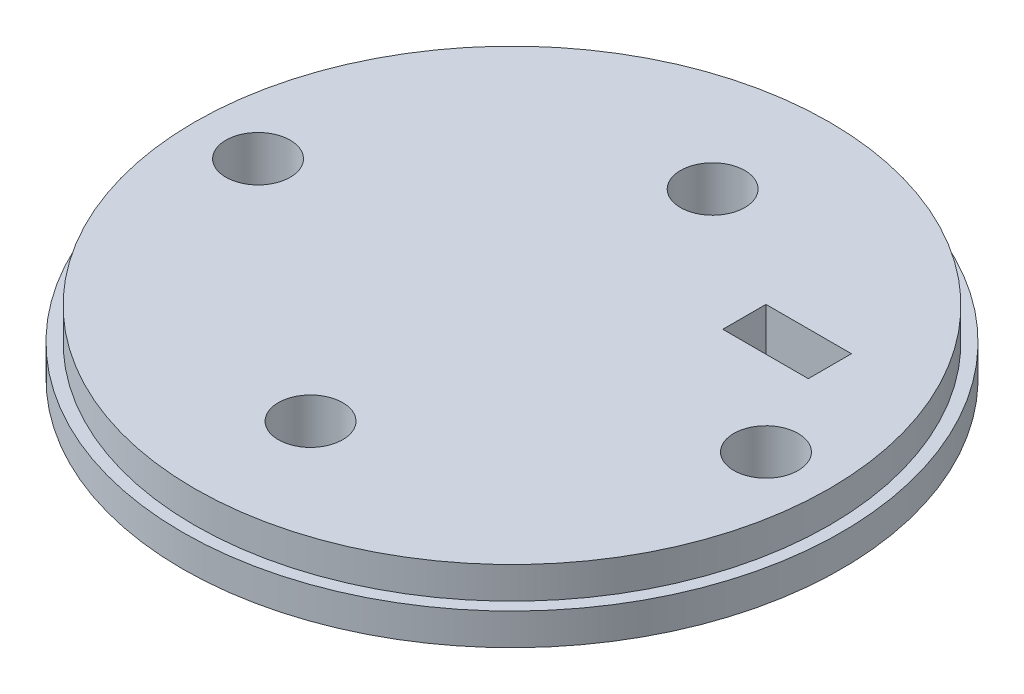
ISO-10303-21;
HEADER;
FILE_DESCRIPTION(('STEP AP214'),'2;1');
FILE_NAME('part.step','',(''),(''),'','','');
FILE_SCHEMA(('AUTOMOTIVE_DESIGN { 1 0 10303 214 1 1 1 1 }'));
ENDSEC;
DATA;
#1=APPLICATION_CONTEXT('core data for automotive mechanical design processes');
#2=APPLICATION_PROTOCOL_DEFINITION('international standard','automotive_design',2000,#1);
#3=PRODUCT_CONTEXT('',#1,'mechanical');
#4=PRODUCT('Part','Part','',(#3));
#5=PRODUCT_RELATED_PRODUCT_CATEGORY('part','',(#4));
#6=PRODUCT_DEFINITION_FORMATION('','',#4);
#7=PRODUCT_DEFINITION_CONTEXT('part definition',#1,'design');
#8=PRODUCT_DEFINITION('design','',#6,#7);
#9=PRODUCT_DEFINITION_SHAPE('','',#8);
#10=(LENGTH_UNIT() NAMED_UNIT(*) SI_UNIT(.MILLI.,.METRE.));
#11=(NAMED_UNIT(*) PLANE_ANGLE_UNIT() SI_UNIT($,.RADIAN.));
#12=(NAMED_UNIT(*) SI_UNIT($,.STERADIAN.) SOLID_ANGLE_UNIT());
#13=UNCERTAINTY_MEASURE_WITH_UNIT(LENGTH_MEASURE(1.E-05),#10,'distance_accuracy_value','');
#14=(GEOMETRIC_REPRESENTATION_CONTEXT(3) GLOBAL_UNCERTAINTY_ASSIGNED_CONTEXT((#13)) GLOBAL_UNIT_ASSIGNED_CONTEXT((#10,
#11,#12)) REPRESENTATION_CONTEXT('',''));
#15=CARTESIAN_POINT('',(0.,0.,0.));
#16=DIRECTION('',(0.,0.,1.));
#17=DIRECTION('',(1.,0.,0.));
#18=AXIS2_PLACEMENT_3D('',#15,#16,#17);
#19=CARTESIAN_POINT('',(0.,0.,0.));
#20=DIRECTION('',(0.,1.,0.));
#21=DIRECTION('',(0.,0.,1.));
#22=AXIS2_PLACEMENT_3D('',#19,#20,#21);
#23=PLANE('',#22);
#24=CARTESIAN_POINT('',(-0.0634999999999993,0.,30.1620766478502));
#25=DIRECTION('',(0.,1.,0.));
#26=DIRECTION('',(0.,0.,1.));
#27=AXIS2_PLACEMENT_3D('',#24,#25,#26);
#28=CIRCLE('',#27,4.826);
#29=CARTESIAN_POINT('',(-0.0634999999999993,0.,25.3360766478502));
#30=VERTEX_POINT('',#29);
#31=EDGE_CURVE('E148',#30,#30,#28,.T.);
#32=ORIENTED_EDGE('',*,*,#31,.T.);
#33=EDGE_LOOP('',(#32));
#34=FACE_BOUND('',#33,.T.);
#35=CARTESIAN_POINT('',(-0.0634999999999993,0.,-30.1620766478502));
#36=DIRECTION('',(0.,1.,0.));
#37=DIRECTION('',(0.,0.,1.));
#38=AXIS2_PLACEMENT_3D('',#35,#36,#37);
#39=CIRCLE('',#38,4.826);
#40=CARTESIAN_POINT('',(-0.0634999999999993,0.,-34.9880766478502));
#41=VERTEX_POINT('',#40);
#42=EDGE_CURVE('E144',#41,#41,#39,.F.);
#43=ORIENTED_EDGE('',*,*,#42,.F.);
#44=EDGE_LOOP('',(#43));
#45=FACE_BOUND('',#44,.T.);
#46=CARTESIAN_POINT('',(0.,0.,0.));
#47=DIRECTION('',(0.,1.,0.));
#48=DIRECTION('',(0.,0.,1.));
#49=AXIS2_PLACEMENT_3D('',#46,#47,#48);
#50=CIRCLE('',#49,49.4411);
#51=CARTESIAN_POINT('',(0.,0.,-49.4411));
#52=VERTEX_POINT('',#51);
#53=EDGE_CURVE('E161',#52,#52,#50,.T.);
#54=ORIENTED_EDGE('',*,*,#53,.F.);
#55=EDGE_LOOP('',(#54));
#56=FACE_BOUND('',#55,.T.);
#57=CARTESIAN_POINT('',(38.1,0.,0.));
#58=DIRECTION('',(0.,1.,0.));
#59=DIRECTION('',(0.,0.,1.));
#60=AXIS2_PLACEMENT_3D('',#57,#58,#59);
#61=CIRCLE('',#60,4.826);
#62=CARTESIAN_POINT('',(38.1,0.,-4.826));
#63=VERTEX_POINT('',#62);
#64=EDGE_CURVE('E125',#63,#63,#61,.F.);
#65=ORIENTED_EDGE('',*,*,#64,.F.);
#66=EDGE_LOOP('',(#65));
#67=FACE_BOUND('',#66,.T.);
#68=CARTESIAN_POINT('',(-38.1,0.,0.));
#69=DIRECTION('',(0.,1.,0.));
#70=DIRECTION('',(0.,0.,1.));
#71=AXIS2_PLACEMENT_3D('',#68,#69,#70);
#72=CIRCLE('',#71,4.826);
#73=CARTESIAN_POINT('',(-38.1,0.,-4.826));
#74=VERTEX_POINT('',#73);
#75=EDGE_CURVE('E140',#74,#74,#72,.T.);
#76=ORIENTED_EDGE('',*,*,#75,.T.);
#77=EDGE_LOOP('',(#76));
#78=FACE_BOUND('',#77,.T.);
#79=DIRECTION('',(-1.,0.,0.));
#80=VECTOR('',#79,1.);
#81=CARTESIAN_POINT('',(31.75,0.,-12.7));
#82=LINE('',#81,#80);
#83=CARTESIAN_POINT('',(31.75,0.,-12.7));
#84=VERTEX_POINT('',#83);
#85=CARTESIAN_POINT('',(18.923,0.,-12.7));
#86=VERTEX_POINT('',#85);
#87=EDGE_CURVE('E87',#84,#86,#82,.T.);
#88=ORIENTED_EDGE('',*,*,#87,.F.);
#89=DIRECTION('',(0.,0.,1.));
#90=VECTOR('',#89,1.);
#91=CARTESIAN_POINT('',(31.75,0.,-19.177));
#92=LINE('',#91,#90);
#93=CARTESIAN_POINT('',(31.75,0.,-19.177));
#94=VERTEX_POINT('',#93);
#95=EDGE_CURVE('E109',#94,#84,#92,.T.);
#96=ORIENTED_EDGE('',*,*,#95,.F.);
#97=DIRECTION('',(-1.,0.,0.));
#98=VECTOR('',#97,1.);
#99=CARTESIAN_POINT('',(31.75,0.,-19.177));
#100=LINE('',#99,#98);
#101=CARTESIAN_POINT('',(18.923,0.,-19.177));
#102=VERTEX_POINT('',#101);
#103=EDGE_CURVE('E60',#94,#102,#100,.T.);
#104=ORIENTED_EDGE('',*,*,#103,.T.);
#105=DIRECTION('',(0.,0.,1.));
#106=VECTOR('',#105,1.);
#107=CARTESIAN_POINT('',(18.923,0.,-19.177));
#108=LINE('',#107,#106);
#109=EDGE_CURVE('E95',#102,#86,#108,.T.);
#110=ORIENTED_EDGE('',*,*,#109,.T.);
#111=EDGE_LOOP('',(#88,#96,#104,#110));
#112=FACE_BOUND('',#111,.T.);
#113=ADVANCED_FACE('F44',(#34,#45,#56,#67,#78,#112),#23,.F.);
#114=CARTESIAN_POINT('',(0.,9.525,0.));
#115=DIRECTION('',(0.,1.,0.));
#116=DIRECTION('',(0.,0.,1.));
#117=AXIS2_PLACEMENT_3D('',#114,#115,#116);
#118=PLANE('',#117);
#119=CARTESIAN_POINT('',(-0.0634999999999993,9.525,-30.1620766478502));
#120=DIRECTION('',(0.,1.,0.));
#121=DIRECTION('',(0.,0.,1.));
#122=AXIS2_PLACEMENT_3D('',#119,#120,#121);
#123=CIRCLE('',#122,4.826);
#124=CARTESIAN_POINT('',(-0.0634999999999993,9.525,-34.9880766478502));
#125=VERTEX_POINT('',#124);
#126=EDGE_CURVE('E126',#125,#125,#123,.T.);
#127=ORIENTED_EDGE('',*,*,#126,.F.);
#128=EDGE_LOOP('',(#127));
#129=FACE_BOUND('',#128,.T.);
#130=CARTESIAN_POINT('',(38.1,9.525,0.));
#131=DIRECTION('',(0.,1.,0.));
#132=DIRECTION('',(0.,0.,1.));
#133=AXIS2_PLACEMENT_3D('',#130,#131,#132);
#134=CIRCLE('',#133,4.826);
#135=CARTESIAN_POINT('',(38.1,9.525,-4.826));
#136=VERTEX_POINT('',#135);
#137=EDGE_CURVE('E103',#136,#136,#134,.T.);
#138=ORIENTED_EDGE('',*,*,#137,.F.);
#139=EDGE_LOOP('',(#138));
#140=FACE_BOUND('',#139,.T.);
#141=CARTESIAN_POINT('',(0.,9.525,0.));
#142=DIRECTION('',(0.,1.,0.));
#143=DIRECTION('',(0.,0.,1.));
#144=AXIS2_PLACEMENT_3D('',#141,#142,#143);
#145=CIRCLE('',#144,47.625);
#146=CARTESIAN_POINT('',(0.,9.525,47.625));
#147=VERTEX_POINT('',#146);
#148=EDGE_CURVE('E152',#147,#147,#145,.T.);
#149=ORIENTED_EDGE('',*,*,#148,.T.);
#150=EDGE_LOOP('',(#149));
#151=FACE_BOUND('',#150,.T.);
#152=CARTESIAN_POINT('',(-38.1,9.525,0.));
#153=DIRECTION('',(0.,-1.,0.));
#154=DIRECTION('',(0.,0.,-1.));
#155=AXIS2_PLACEMENT_3D('',#152,#153,#154);
#156=CIRCLE('',#155,4.826);
#157=CARTESIAN_POINT('',(-38.1,9.525,-4.826));
#158=VERTEX_POINT('',#157);
#159=EDGE_CURVE('E130',#158,#158,#156,.T.);
#160=ORIENTED_EDGE('',*,*,#159,.T.);
#161=EDGE_LOOP('',(#160));
#162=FACE_BOUND('',#161,.T.);
#163=CARTESIAN_POINT('',(-0.0634999999999993,9.525,30.1620766478502));
#164=DIRECTION('',(0.,-1.,0.));
#165=DIRECTION('',(0.,0.,-1.));
#166=AXIS2_PLACEMENT_3D('',#163,#164,#165);
#167=CIRCLE('',#166,4.826);
#168=CARTESIAN_POINT('',(-0.0634999999999993,9.525,25.3360766478502));
#169=VERTEX_POINT('',#168);
#170=EDGE_CURVE('E121',#169,#169,#167,.T.);
#171=ORIENTED_EDGE('',*,*,#170,.T.);
#172=EDGE_LOOP('',(#171));
#173=FACE_BOUND('',#172,.T.);
#174=DIRECTION('',(0.,0.,1.));
#175=VECTOR('',#174,1.);
#176=CARTESIAN_POINT('',(31.75,9.525,0.));
#177=LINE('',#176,#175);
#178=CARTESIAN_POINT('',(31.75,9.525,-19.177));
#179=VERTEX_POINT('',#178);
#180=CARTESIAN_POINT('',(31.75,9.525,-12.7));
#181=VERTEX_POINT('',#180);
#182=EDGE_CURVE('E165',#179,#181,#177,.T.);
#183=ORIENTED_EDGE('',*,*,#182,.T.);
#184=DIRECTION('',(-1.,0.,0.));
#185=VECTOR('',#184,1.);
#186=CARTESIAN_POINT('',(0.,9.525,-12.7));
#187=LINE('',#186,#185);
#188=CARTESIAN_POINT('',(18.923,9.525,-12.7));
#189=VERTEX_POINT('',#188);
#190=EDGE_CURVE('E11',#181,#189,#187,.T.);
#191=ORIENTED_EDGE('',*,*,#190,.T.);
#192=DIRECTION('',(0.,0.,1.));
#193=VECTOR('',#192,1.);
#194=CARTESIAN_POINT('',(18.923,9.525,0.));
#195=LINE('',#194,#193);
#196=CARTESIAN_POINT('',(18.923,9.525,-19.177));
#197=VERTEX_POINT('',#196);
#198=EDGE_CURVE('E53',#197,#189,#195,.T.);
#199=ORIENTED_EDGE('',*,*,#198,.F.);
#200=DIRECTION('',(-1.,0.,0.));
#201=VECTOR('',#200,1.);
#202=CARTESIAN_POINT('',(0.,9.525,-19.177));
#203=LINE('',#202,#201);
#204=EDGE_CURVE('E172',#179,#197,#203,.T.);
#205=ORIENTED_EDGE('',*,*,#204,.F.);
#206=EDGE_LOOP('',(#183,#191,#199,#205));
#207=FACE_BOUND('',#206,.T.);
#208=ADVANCED_FACE('F178',(#129,#140,#151,#162,#173,#207),#118,.T.);
#209=CARTESIAN_POINT('',(0.,9.525,0.));
#210=DIRECTION('',(0.,-1.,0.));
#211=DIRECTION('',(0.,0.,-1.));
#212=AXIS2_PLACEMENT_3D('',#209,#210,#211);
#213=CYLINDRICAL_SURFACE('',#212,49.4411);
#214=CARTESIAN_POINT('',(0.,4.7625,0.));
#215=DIRECTION('',(0.,1.,0.));
#216=DIRECTION('',(0.,0.,1.));
#217=AXIS2_PLACEMENT_3D('',#214,#215,#216);
#218=CIRCLE('',#217,49.4411);
#219=CARTESIAN_POINT('',(0.,4.7625,-49.4411));
#220=VERTEX_POINT('',#219);
#221=EDGE_CURVE('E157',#220,#220,#218,.T.);
#222=CARTESIAN_POINT('',(0.,0.,-49.4411));
#223=CARTESIAN_POINT('',(0.,0.049609375,-49.4411));
#224=CARTESIAN_POINT('',(0.,0.09921875,-49.4411));
#225=CARTESIAN_POINT('',(0.,0.1984375,-49.4411));
#226=CARTESIAN_POINT('',(0.,0.248046875,-49.4411));
#227=CARTESIAN_POINT('',(0.,0.347265625,-49.4411));
#228=CARTESIAN_POINT('',(0.,0.396875,-49.4411));
#229=CARTESIAN_POINT('',(0.,0.49609375,-49.4411));
#230=CARTESIAN_POINT('',(0.,0.545703125,-49.4411));
#231=CARTESIAN_POINT('',(0.,0.644921875,-49.4411));
#232=CARTESIAN_POINT('',(0.,0.69453125,-49.4411));
#233=CARTESIAN_POINT('',(0.,0.793750000000001,-49.4411));
#234=CARTESIAN_POINT('',(0.,0.843359375,-49.4411));
#235=CARTESIAN_POINT('',(0.,0.942578125000001,-49.4411));
#236=CARTESIAN_POINT('',(0.,0.992187500000001,-49.4411));
#237=CARTESIAN_POINT('',(0.,1.09140625,-49.4411));
#238=CARTESIAN_POINT('',(0.,1.141015625,-49.4411));
#239=CARTESIAN_POINT('',(0.,1.240234375,-49.4411));
#240=CARTESIAN_POINT('',(0.,1.28984375,-49.4411));
#241=CARTESIAN_POINT('',(0.,1.3890625,-49.4411));
#242=CARTESIAN_POINT('',(0.,1.438671875,-49.4411));
#243=CARTESIAN_POINT('',(0.,1.537890625,-49.4411));
#244=CARTESIAN_POINT('',(0.,1.5875,-49.4411));
#245=CARTESIAN_POINT('',(0.,1.68671875,-49.4411));
#246=CARTESIAN_POINT('',(0.,1.736328125,-49.4411));
#247=CARTESIAN_POINT('',(0.,1.835546875,-49.4411));
#248=CARTESIAN_POINT('',(0.,1.88515625,-49.4411));
#249=CARTESIAN_POINT('',(0.,1.984375,-49.4411));
#250=CARTESIAN_POINT('',(0.,2.033984375,-49.4411));
#251=CARTESIAN_POINT('',(0.,2.133203125,-49.4411));
#252=CARTESIAN_POINT('',(0.,2.1828125,-49.4411));
#253=CARTESIAN_POINT('',(0.,2.28203125,-49.4411));
#254=CARTESIAN_POINT('',(0.,2.331640625,-49.4411));
#255=CARTESIAN_POINT('',(0.,2.430859375,-49.4411));
#256=CARTESIAN_POINT('',(0.,2.48046875,-49.4411));
#257=CARTESIAN_POINT('',(0.,2.5796875,-49.4411));
#258=CARTESIAN_POINT('',(0.,2.629296875,-49.4411));
#259=CARTESIAN_POINT('',(0.,2.728515625,-49.4411));
#260=CARTESIAN_POINT('',(0.,2.778125,-49.4411));
#261=CARTESIAN_POINT('',(0.,2.87734375,-49.4411));
#262=CARTESIAN_POINT('',(0.,2.926953125,-49.4411));
#263=CARTESIAN_POINT('',(0.,3.026171875,-49.4411));
#264=CARTESIAN_POINT('',(0.,3.07578125,-49.4411));
#265=CARTESIAN_POINT('',(0.,3.175,-49.4411));
#266=CARTESIAN_POINT('',(0.,3.224609375,-49.4411));
#267=CARTESIAN_POINT('',(0.,3.323828125,-49.4411));
#268=CARTESIAN_POINT('',(0.,3.3734375,-49.4411));
#269=CARTESIAN_POINT('',(0.,3.47265625,-49.4411));
#270=CARTESIAN_POINT('',(0.,3.522265625,-49.4411));
#271=CARTESIAN_POINT('',(0.,3.621484375,-49.4411));
#272=CARTESIAN_POINT('',(0.,3.67109375,-49.4411));
#273=CARTESIAN_POINT('',(0.,3.7703125,-49.4411));
#274=CARTESIAN_POINT('',(0.,3.819921875,-49.4411));
#275=CARTESIAN_POINT('',(0.,3.919140625,-49.4411));
#276=CARTESIAN_POINT('',(0.,3.96875,-49.4411));
#277=CARTESIAN_POINT('',(0.,4.06796875,-49.4411));
#278=CARTESIAN_POINT('',(0.,4.117578125,-49.4411));
#279=CARTESIAN_POINT('',(0.,4.216796875,-49.4411));
#280=CARTESIAN_POINT('',(0.,4.26640625,-49.4411));
#281=CARTESIAN_POINT('',(0.,4.365625,-49.4411));
#282=CARTESIAN_POINT('',(0.,4.415234375,-49.4411));
#283=CARTESIAN_POINT('',(0.,4.514453125,-49.4411));
#284=CARTESIAN_POINT('',(0.,4.5640625,-49.4411));
#285=CARTESIAN_POINT('',(0.,4.66328125,-49.4411));
#286=CARTESIAN_POINT('',(0.,4.712890625,-49.4411));
#287=CARTESIAN_POINT('',(0.,4.7625,-49.4411));
#288=B_SPLINE_CURVE_WITH_KNOTS('',3,(#222,#223,#224,#225,#226,#227,#228,#229,#230,#231,#232,
#233,#234,#235,#236,#237,#238,#239,#240,#241,#242,#243,#244,#245,#246,#247,#248,#249,#250,#251,
#252,#253,#254,#255,#256,#257,#258,#259,#260,#261,#262,#263,#264,#265,#266,#267,#268,#269,#270,
#271,#272,#273,#274,#275,#276,#277,#278,#279,#280,#281,#282,#283,#284,#285,#286,#287),
.UNSPECIFIED.,.F.,.F.,(4,2,2,2,2,2,2,2,2,2,2,2,2,2,2,2,2,2,2,2,2,2,2,2,2,2,2,2,2,2,2,2,4),(0.,
0.148828125,0.29765625,0.446484375,0.5953125,0.744140625,0.892968750000001,1.041796875,1.190625,
1.339453125,1.48828125,1.637109375,1.7859375,1.934765625,2.08359375,2.232421875,2.38125,
2.530078125,2.67890625,2.827734375,2.9765625,3.125390625,3.27421875,3.423046875,3.571875,
3.720703125,3.86953125,4.018359375,4.1671875,4.316015625,4.46484375,4.613671875,4.7625),.UNSPECIFIED.);
#289=EDGE_CURVE('BSEAM46',#52,#220,#288,.T.);
#290=ORIENTED_EDGE('',*,*,#53,.T.);
#291=ORIENTED_EDGE('',*,*,#221,.F.);
#292=ORIENTED_EDGE('',*,*,#289,.T.);
#293=ORIENTED_EDGE('',*,*,#289,.F.);
#294=EDGE_LOOP('',(#290,#292,#291,#293));
#295=FACE_BOUND('',#294,.T.);
#296=ADVANCED_FACE('F46',(#295),#213,.T.);
#297=CARTESIAN_POINT('',(0.,4.7625,0.));
#298=DIRECTION('',(0.,1.,0.));
#299=DIRECTION('',(0.,0.,1.));
#300=AXIS2_PLACEMENT_3D('',#297,#298,#299);
#301=PLANE('',#300);
#302=CARTESIAN_POINT('',(0.,4.7625,0.));
#303=DIRECTION('',(0.,1.,0.));
#304=DIRECTION('',(0.,0.,1.));
#305=AXIS2_PLACEMENT_3D('',#302,#303,#304);
#306=CIRCLE('',#305,47.625);
#307=CARTESIAN_POINT('',(0.,4.7625,47.625));
#308=VERTEX_POINT('',#307);
#309=EDGE_CURVE('E153',#308,#308,#306,.T.);
#310=ORIENTED_EDGE('',*,*,#309,.F.);
#311=EDGE_LOOP('',(#310));
#312=FACE_BOUND('',#311,.T.);
#313=ORIENTED_EDGE('',*,*,#221,.T.);
#314=EDGE_LOOP('',(#313));
#315=FACE_BOUND('',#314,.T.);
#316=ADVANCED_FACE('F196',(#312,#315),#301,.T.);
#317=CARTESIAN_POINT('',(0.,4.7625,0.));
#318=DIRECTION('',(0.,1.,0.));
#319=DIRECTION('',(0.,0.,1.));
#320=AXIS2_PLACEMENT_3D('',#317,#318,#319);
#321=CYLINDRICAL_SURFACE('',#320,47.625);
#322=CARTESIAN_POINT('',(0.,4.7625,47.625));
#323=CARTESIAN_POINT('',(0.,4.812109375,47.625));
#324=CARTESIAN_POINT('',(0.,4.86171875,47.625));
#325=CARTESIAN_POINT('',(0.,4.9609375,47.625));
#326=CARTESIAN_POINT('',(0.,5.010546875,47.625));
#327=CARTESIAN_POINT('',(0.,5.109765625,47.625));
#328=CARTESIAN_POINT('',(0.,5.159375,47.625));
#329=CARTESIAN_POINT('',(0.,5.25859375,47.625));
#330=CARTESIAN_POINT('',(0.,5.308203125,47.625));
#331=CARTESIAN_POINT('',(0.,5.407421875,47.625));
#332=CARTESIAN_POINT('',(0.,5.45703125,47.625));
#333=CARTESIAN_POINT('',(0.,5.55625,47.625));
#334=CARTESIAN_POINT('',(0.,5.605859375,47.625));
#335=CARTESIAN_POINT('',(0.,5.705078125,47.625));
#336=CARTESIAN_POINT('',(0.,5.7546875,47.625));
#337=CARTESIAN_POINT('',(0.,5.85390625,47.625));
#338=CARTESIAN_POINT('',(0.,5.903515625,47.625));
#339=CARTESIAN_POINT('',(0.,6.002734375,47.625));
#340=CARTESIAN_POINT('',(0.,6.05234375,47.625));
#341=CARTESIAN_POINT('',(0.,6.1515625,47.625));
#342=CARTESIAN_POINT('',(0.,6.201171875,47.625));
#343=CARTESIAN_POINT('',(0.,6.300390625,47.625));
#344=CARTESIAN_POINT('',(0.,6.35,47.625));
#345=CARTESIAN_POINT('',(0.,6.44921875,47.625));
#346=CARTESIAN_POINT('',(0.,6.498828125,47.625));
#347=CARTESIAN_POINT('',(0.,6.598046875,47.625));
#348=CARTESIAN_POINT('',(0.,6.64765625,47.625));
#349=CARTESIAN_POINT('',(0.,6.746875,47.625));
#350=CARTESIAN_POINT('',(0.,6.796484375,47.625));
#351=CARTESIAN_POINT('',(0.,6.895703125,47.625));
#352=CARTESIAN_POINT('',(0.,6.9453125,47.625));
#353=CARTESIAN_POINT('',(0.,7.04453125,47.625));
#354=CARTESIAN_POINT('',(0.,7.094140625,47.625));
#355=CARTESIAN_POINT('',(0.,7.193359375,47.625));
#356=CARTESIAN_POINT('',(0.,7.24296875,47.625));
#357=CARTESIAN_POINT('',(0.,7.3421875,47.625));
#358=CARTESIAN_POINT('',(0.,7.391796875,47.625));
#359=CARTESIAN_POINT('',(0.,7.491015625,47.625));
#360=CARTESIAN_POINT('',(0.,7.540625,47.625));
#361=CARTESIAN_POINT('',(0.,7.63984375,47.625));
#362=CARTESIAN_POINT('',(0.,7.689453125,47.625));
#363=CARTESIAN_POINT('',(0.,7.788671875,47.625));
#364=CARTESIAN_POINT('',(0.,7.83828125,47.625));
#365=CARTESIAN_POINT('',(0.,7.9375,47.625));
#366=CARTESIAN_POINT('',(0.,7.987109375,47.625));
#367=CARTESIAN_POINT('',(0.,8.086328125,47.625));
#368=CARTESIAN_POINT('',(0.,8.1359375,47.625));
#369=CARTESIAN_POINT('',(0.,8.23515625,47.625));
#370=CARTESIAN_POINT('',(0.,8.284765625,47.625));
#371=CARTESIAN_POINT('',(0.,8.383984375,47.625));
#372=CARTESIAN_POINT('',(0.,8.43359375,47.625));
#373=CARTESIAN_POINT('',(0.,8.5328125,47.625));
#374=CARTESIAN_POINT('',(0.,8.582421875,47.625));
#375=CARTESIAN_POINT('',(0.,8.681640625,47.625));
#376=CARTESIAN_POINT('',(0.,8.73125,47.625));
#377=CARTESIAN_POINT('',(0.,8.83046875,47.625));
#378=CARTESIAN_POINT('',(0.,8.880078125,47.625));
#379=CARTESIAN_POINT('',(0.,8.979296875,47.625));
#380=CARTESIAN_POINT('',(0.,9.02890625,47.625));
#381=CARTESIAN_POINT('',(0.,9.128125,47.625));
#382=CARTESIAN_POINT('',(0.,9.177734375,47.625));
#383=CARTESIAN_POINT('',(0.,9.276953125,47.625));
#384=CARTESIAN_POINT('',(0.,9.3265625,47.625));
#385=CARTESIAN_POINT('',(0.,9.42578125,47.625));
#386=CARTESIAN_POINT('',(0.,9.475390625,47.625));
#387=CARTESIAN_POINT('',(0.,9.525,47.625));
#388=B_SPLINE_CURVE_WITH_KNOTS('',3,(#322,#323,#324,#325,#326,#327,#328,#329,#330,#331,#332,
#333,#334,#335,#336,#337,#338,#339,#340,#341,#342,#343,#344,#345,#346,#347,#348,#349,#350,#351,
#352,#353,#354,#355,#356,#357,#358,#359,#360,#361,#362,#363,#364,#365,#366,#367,#368,#369,#370,
#371,#372,#373,#374,#375,#376,#377,#378,#379,#380,#381,#382,#383,#384,#385,#386,#387),
.UNSPECIFIED.,.F.,.F.,(4,2,2,2,2,2,2,2,2,2,2,2,2,2,2,2,2,2,2,2,2,2,2,2,2,2,2,2,2,2,2,2,4),(0.,
0.148828124999999,0.297656249999999,0.446484374999999,0.595312499999999,0.744140625,0.89296875,
1.041796875,1.190625,1.339453125,1.48828125,1.637109375,1.7859375,1.934765625,2.08359375,
2.232421875,2.38125,2.530078125,2.67890625,2.827734375,2.9765625,3.125390625,3.27421875,
3.423046875,3.571875,3.720703125,3.86953125,4.018359375,4.1671875,4.316015625,4.46484375,
4.613671875,4.7625),.UNSPECIFIED.);
#389=EDGE_CURVE('BSEAM199',#308,#147,#388,.T.);
#390=ORIENTED_EDGE('',*,*,#309,.T.);
#391=ORIENTED_EDGE('',*,*,#148,.F.);
#392=ORIENTED_EDGE('',*,*,#389,.T.);
#393=ORIENTED_EDGE('',*,*,#389,.F.);
#394=EDGE_LOOP('',(#390,#392,#391,#393));
#395=FACE_BOUND('',#394,.T.);
#396=ADVANCED_FACE('F199',(#395),#321,.T.);
#397=CARTESIAN_POINT('',(38.1,9.525,0.));
#398=DIRECTION('',(0.,-1.,0.));
#399=DIRECTION('',(0.,0.,-1.));
#400=AXIS2_PLACEMENT_3D('',#397,#398,#399);
#401=CYLINDRICAL_SURFACE('',#400,4.826);
#402=CARTESIAN_POINT('',(38.1,9.525,-4.826));
#403=CARTESIAN_POINT('',(38.1,9.42578125,-4.826));
#404=CARTESIAN_POINT('',(38.1,9.3265625,-4.826));
#405=CARTESIAN_POINT('',(38.1,9.128125,-4.826));
#406=CARTESIAN_POINT('',(38.1,9.02890625,-4.826));
#407=CARTESIAN_POINT('',(38.1,8.83046875,-4.826));
#408=CARTESIAN_POINT('',(38.1,8.73125,-4.826));
#409=CARTESIAN_POINT('',(38.1,8.5328125,-4.826));
#410=CARTESIAN_POINT('',(38.1,8.43359375,-4.826));
#411=CARTESIAN_POINT('',(38.1,8.23515625,-4.826));
#412=CARTESIAN_POINT('',(38.1,8.1359375,-4.826));
#413=CARTESIAN_POINT('',(38.1,7.9375,-4.826));
#414=CARTESIAN_POINT('',(38.1,7.83828125,-4.826));
#415=CARTESIAN_POINT('',(38.1,7.63984375,-4.826));
#416=CARTESIAN_POINT('',(38.1,7.540625,-4.826));
#417=CARTESIAN_POINT('',(38.1,7.3421875,-4.826));
#418=CARTESIAN_POINT('',(38.1,7.24296875,-4.826));
#419=CARTESIAN_POINT('',(38.1,7.04453125,-4.826));
#420=CARTESIAN_POINT('',(38.1,6.9453125,-4.826));
#421=CARTESIAN_POINT('',(38.1,6.746875,-4.826));
#422=CARTESIAN_POINT('',(38.1,6.64765625,-4.826));
#423=CARTESIAN_POINT('',(38.1,6.44921875,-4.826));
#424=CARTESIAN_POINT('',(38.1,6.35,-4.826));
#425=CARTESIAN_POINT('',(38.1,6.1515625,-4.826));
#426=CARTESIAN_POINT('',(38.1,6.05234375,-4.826));
#427=CARTESIAN_POINT('',(38.1,5.85390625,-4.826));
#428=CARTESIAN_POINT('',(38.1,5.7546875,-4.826));
#429=CARTESIAN_POINT('',(38.1,5.55625,-4.826));
#430=CARTESIAN_POINT('',(38.1,5.45703125,-4.826));
#431=CARTESIAN_POINT('',(38.1,5.25859375,-4.826));
#432=CARTESIAN_POINT('',(38.1,5.159375,-4.826));
#433=CARTESIAN_POINT('',(38.1,4.9609375,-4.826));
#434=CARTESIAN_POINT('',(38.1,4.86171875,-4.826));
#435=CARTESIAN_POINT('',(38.1,4.66328125,-4.826));
#436=CARTESIAN_POINT('',(38.1,4.5640625,-4.826));
#437=CARTESIAN_POINT('',(38.1,4.365625,-4.826));
#438=CARTESIAN_POINT('',(38.1,4.26640625,-4.826));
#439=CARTESIAN_POINT('',(38.1,4.06796875,-4.826));
#440=CARTESIAN_POINT('',(38.1,3.96875,-4.826));
#441=CARTESIAN_POINT('',(38.1,3.7703125,-4.826));
#442=CARTESIAN_POINT('',(38.1,3.67109375,-4.826));
#443=CARTESIAN_POINT('',(38.1,3.47265625,-4.826));
#444=CARTESIAN_POINT('',(38.1,3.3734375,-4.826));
#445=CARTESIAN_POINT('',(38.1,3.175,-4.826));
#446=CARTESIAN_POINT('',(38.1,3.07578125,-4.826));
#447=CARTESIAN_POINT('',(38.1,2.87734375,-4.826));
#448=CARTESIAN_POINT('',(38.1,2.778125,-4.826));
#449=CARTESIAN_POINT('',(38.1,2.5796875,-4.826));
#450=CARTESIAN_POINT('',(38.1,2.48046875,-4.826));
#451=CARTESIAN_POINT('',(38.1,2.28203125,-4.826));
#452=CARTESIAN_POINT('',(38.1,2.1828125,-4.826));
#453=CARTESIAN_POINT('',(38.1,1.984375,-4.826));
#454=CARTESIAN_POINT('',(38.1,1.88515625,-4.826));
#455=CARTESIAN_POINT('',(38.1,1.68671875,-4.826));
#456=CARTESIAN_POINT('',(38.1,1.5875,-4.826));
#457=CARTESIAN_POINT('',(38.1,1.3890625,-4.826));
#458=CARTESIAN_POINT('',(38.1,1.28984375,-4.826));
#459=CARTESIAN_POINT('',(38.1,1.09140625,-4.826));
#460=CARTESIAN_POINT('',(38.1,0.992187500000001,-4.826));
#461=CARTESIAN_POINT('',(38.1,0.793750000000001,-4.826));
#462=CARTESIAN_POINT('',(38.1,0.69453125,-4.826));
#463=CARTESIAN_POINT('',(38.1,0.49609375,-4.826));
#464=CARTESIAN_POINT('',(38.1,0.396875,-4.826));
#465=CARTESIAN_POINT('',(38.1,0.1984375,-4.826));
#466=CARTESIAN_POINT('',(38.1,0.0992187500000001,-4.826));
#467=CARTESIAN_POINT('',(38.1,0.,-4.826));
#468=B_SPLINE_CURVE_WITH_KNOTS('',3,(#402,#403,#404,#405,#406,#407,#408,#409,#410,#411,#412,
#413,#414,#415,#416,#417,#418,#419,#420,#421,#422,#423,#424,#425,#426,#427,#428,#429,#430,#431,
#432,#433,#434,#435,#436,#437,#438,#439,#440,#441,#442,#443,#444,#445,#446,#447,#448,#449,#450,
#451,#452,#453,#454,#455,#456,#457,#458,#459,#460,#461,#462,#463,#464,#465,#466,#467),
.UNSPECIFIED.,.F.,.F.,(4,2,2,2,2,2,2,2,2,2,2,2,2,2,2,2,2,2,2,2,2,2,2,2,2,2,2,2,2,2,2,2,4),(0.,
0.29765625,0.5953125,0.892968750000001,1.190625,1.48828125,1.7859375,2.08359375,2.38125,
2.67890625,2.9765625,3.27421875,3.571875,3.86953125,4.1671875,4.46484375,4.7625,5.06015625,
5.3578125,5.65546875,5.953125,6.25078125,6.5484375,6.84609375,7.14375,7.44140625,7.7390625,
8.03671875,8.334375,8.63203125,8.9296875,9.22734375,9.525),.UNSPECIFIED.);
#469=EDGE_CURVE('BSEAM203',#136,#63,#468,.T.);
#470=ORIENTED_EDGE('',*,*,#137,.T.);
#471=ORIENTED_EDGE('',*,*,#64,.T.);
#472=ORIENTED_EDGE('',*,*,#469,.T.);
#473=ORIENTED_EDGE('',*,*,#469,.F.);
#474=EDGE_LOOP('',(#470,#472,#471,#473));
#475=FACE_BOUND('',#474,.T.);
#476=ADVANCED_FACE('F203',(#475),#401,.F.);
#477=CARTESIAN_POINT('',(-38.1,9.525,0.));
#478=DIRECTION('',(0.,-1.,0.));
#479=DIRECTION('',(0.,0.,-1.));
#480=AXIS2_PLACEMENT_3D('',#477,#478,#479);
#481=CYLINDRICAL_SURFACE('',#480,4.826);
#482=CARTESIAN_POINT('',(-38.1,9.525,-4.826));
#483=CARTESIAN_POINT('',(-38.1,9.42578125,-4.826));
#484=CARTESIAN_POINT('',(-38.1,9.3265625,-4.826));
#485=CARTESIAN_POINT('',(-38.1,9.128125,-4.826));
#486=CARTESIAN_POINT('',(-38.1,9.02890625,-4.826));
#487=CARTESIAN_POINT('',(-38.1,8.83046875,-4.826));
#488=CARTESIAN_POINT('',(-38.1,8.73125,-4.826));
#489=CARTESIAN_POINT('',(-38.1,8.5328125,-4.826));
#490=CARTESIAN_POINT('',(-38.1,8.43359375,-4.826));
#491=CARTESIAN_POINT('',(-38.1,8.23515625,-4.826));
#492=CARTESIAN_POINT('',(-38.1,8.1359375,-4.826));
#493=CARTESIAN_POINT('',(-38.1,7.9375,-4.826));
#494=CARTESIAN_POINT('',(-38.1,7.83828125,-4.826));
#495=CARTESIAN_POINT('',(-38.1,7.63984375,-4.826));
#496=CARTESIAN_POINT('',(-38.1,7.540625,-4.826));
#497=CARTESIAN_POINT('',(-38.1,7.3421875,-4.826));
#498=CARTESIAN_POINT('',(-38.1,7.24296875,-4.826));
#499=CARTESIAN_POINT('',(-38.1,7.04453125,-4.826));
#500=CARTESIAN_POINT('',(-38.1,6.9453125,-4.826));
#501=CARTESIAN_POINT('',(-38.1,6.746875,-4.826));
#502=CARTESIAN_POINT('',(-38.1,6.64765625,-4.826));
#503=CARTESIAN_POINT('',(-38.1,6.44921875,-4.826));
#504=CARTESIAN_POINT('',(-38.1,6.35,-4.826));
#505=CARTESIAN_POINT('',(-38.1,6.1515625,-4.826));
#506=CARTESIAN_POINT('',(-38.1,6.05234375,-4.826));
#507=CARTESIAN_POINT('',(-38.1,5.85390625,-4.826));
#508=CARTESIAN_POINT('',(-38.1,5.7546875,-4.826));
#509=CARTESIAN_POINT('',(-38.1,5.55625,-4.826));
#510=CARTESIAN_POINT('',(-38.1,5.45703125,-4.826));
#511=CARTESIAN_POINT('',(-38.1,5.25859375,-4.826));
#512=CARTESIAN_POINT('',(-38.1,5.159375,-4.826));
#513=CARTESIAN_POINT('',(-38.1,4.9609375,-4.826));
#514=CARTESIAN_POINT('',(-38.1,4.86171875,-4.826));
#515=CARTESIAN_POINT('',(-38.1,4.66328125,-4.826));
#516=CARTESIAN_POINT('',(-38.1,4.5640625,-4.826));
#517=CARTESIAN_POINT('',(-38.1,4.365625,-4.826));
#518=CARTESIAN_POINT('',(-38.1,4.26640625,-4.826));
#519=CARTESIAN_POINT('',(-38.1,4.06796875,-4.826));
#520=CARTESIAN_POINT('',(-38.1,3.96875,-4.826));
#521=CARTESIAN_POINT('',(-38.1,3.7703125,-4.826));
#522=CARTESIAN_POINT('',(-38.1,3.67109375,-4.826));
#523=CARTESIAN_POINT('',(-38.1,3.47265625,-4.826));
#524=CARTESIAN_POINT('',(-38.1,3.3734375,-4.826));
#525=CARTESIAN_POINT('',(-38.1,3.175,-4.826));
#526=CARTESIAN_POINT('',(-38.1,3.07578125,-4.826));
#527=CARTESIAN_POINT('',(-38.1,2.87734375,-4.826));
#528=CARTESIAN_POINT('',(-38.1,2.778125,-4.826));
#529=CARTESIAN_POINT('',(-38.1,2.5796875,-4.826));
#530=CARTESIAN_POINT('',(-38.1,2.48046875,-4.826));
#531=CARTESIAN_POINT('',(-38.1,2.28203125,-4.826));
#532=CARTESIAN_POINT('',(-38.1,2.1828125,-4.826));
#533=CARTESIAN_POINT('',(-38.1,1.984375,-4.826));
#534=CARTESIAN_POINT('',(-38.1,1.88515625,-4.826));
#535=CARTESIAN_POINT('',(-38.1,1.68671875,-4.826));
#536=CARTESIAN_POINT('',(-38.1,1.5875,-4.826));
#537=CARTESIAN_POINT('',(-38.1,1.3890625,-4.826));
#538=CARTESIAN_POINT('',(-38.1,1.28984375,-4.826));
#539=CARTESIAN_POINT('',(-38.1,1.09140625,-4.826));
#540=CARTESIAN_POINT('',(-38.1,0.992187500000001,-4.826));
#541=CARTESIAN_POINT('',(-38.1,0.793750000000001,-4.826));
#542=CARTESIAN_POINT('',(-38.1,0.69453125,-4.826));
#543=CARTESIAN_POINT('',(-38.1,0.49609375,-4.826));
#544=CARTESIAN_POINT('',(-38.1,0.396875,-4.826));
#545=CARTESIAN_POINT('',(-38.1,0.1984375,-4.826));
#546=CARTESIAN_POINT('',(-38.1,0.0992187500000001,-4.826));
#547=CARTESIAN_POINT('',(-38.1,0.,-4.826));
#548=B_SPLINE_CURVE_WITH_KNOTS('',3,(#482,#483,#484,#485,#486,#487,#488,#489,#490,#491,#492,
#493,#494,#495,#496,#497,#498,#499,#500,#501,#502,#503,#504,#505,#506,#507,#508,#509,#510,#511,
#512,#513,#514,#515,#516,#517,#518,#519,#520,#521,#522,#523,#524,#525,#526,#527,#528,#529,#530,
#531,#532,#533,#534,#535,#536,#537,#538,#539,#540,#541,#542,#543,#544,#545,#546,#547),
.UNSPECIFIED.,.F.,.F.,(4,2,2,2,2,2,2,2,2,2,2,2,2,2,2,2,2,2,2,2,2,2,2,2,2,2,2,2,2,2,2,2,4),(0.,
0.297656249999998,0.595312499999999,0.892968749999999,1.190625,1.48828125,1.7859375,2.08359375,
2.38125,2.67890625,2.9765625,3.27421875,3.571875,3.86953125,4.1671875,4.46484375,4.7625,
5.06015625,5.3578125,5.65546875,5.953125,6.25078125,6.5484375,6.84609375,7.14375,7.44140625,
7.7390625,8.03671875,8.334375,8.63203125,8.9296875,9.22734375,9.525),.UNSPECIFIED.);
#549=EDGE_CURVE('BSEAM207',#158,#74,#548,.T.);
#550=ORIENTED_EDGE('',*,*,#159,.F.);
#551=ORIENTED_EDGE('',*,*,#75,.F.);
#552=ORIENTED_EDGE('',*,*,#549,.T.);
#553=ORIENTED_EDGE('',*,*,#549,.F.);
#554=EDGE_LOOP('',(#550,#552,#551,#553));
#555=FACE_BOUND('',#554,.T.);
#556=ADVANCED_FACE('F207',(#555),#481,.F.);
#557=CARTESIAN_POINT('',(-0.0634999999999993,9.525,-30.1620766478502));
#558=DIRECTION('',(0.,-1.,0.));
#559=DIRECTION('',(0.,0.,-1.));
#560=AXIS2_PLACEMENT_3D('',#557,#558,#559);
#561=CYLINDRICAL_SURFACE('',#560,4.826);
#562=CARTESIAN_POINT('',(-0.0634999999999993,9.525,-34.9880766478502));
#563=CARTESIAN_POINT('',(-0.0634999999999993,9.42578125,-34.9880766478502));
#564=CARTESIAN_POINT('',(-0.0634999999999993,9.3265625,-34.9880766478502));
#565=CARTESIAN_POINT('',(-0.0634999999999993,9.128125,-34.9880766478502));
#566=CARTESIAN_POINT('',(-0.0634999999999993,9.02890625,-34.9880766478502));
#567=CARTESIAN_POINT('',(-0.0634999999999993,8.83046875,-34.9880766478502));
#568=CARTESIAN_POINT('',(-0.0634999999999993,8.73125,-34.9880766478502));
#569=CARTESIAN_POINT('',(-0.0634999999999993,8.5328125,-34.9880766478502));
#570=CARTESIAN_POINT('',(-0.0634999999999993,8.43359375,-34.9880766478502));
#571=CARTESIAN_POINT('',(-0.0634999999999993,8.23515625,-34.9880766478502));
#572=CARTESIAN_POINT('',(-0.0634999999999993,8.1359375,-34.9880766478502));
#573=CARTESIAN_POINT('',(-0.0634999999999993,7.9375,-34.9880766478502));
#574=CARTESIAN_POINT('',(-0.0634999999999993,7.83828125,-34.9880766478502));
#575=CARTESIAN_POINT('',(-0.0634999999999993,7.63984375,-34.9880766478502));
#576=CARTESIAN_POINT('',(-0.0634999999999993,7.540625,-34.9880766478502));
#577=CARTESIAN_POINT('',(-0.0634999999999993,7.3421875,-34.9880766478502));
#578=CARTESIAN_POINT('',(-0.0634999999999993,7.24296875,-34.9880766478502));
#579=CARTESIAN_POINT('',(-0.0634999999999993,7.04453125,-34.9880766478502));
#580=CARTESIAN_POINT('',(-0.0634999999999993,6.9453125,-34.9880766478502));
#581=CARTESIAN_POINT('',(-0.0634999999999993,6.746875,-34.9880766478502));
#582=CARTESIAN_POINT('',(-0.0634999999999993,6.64765625,-34.9880766478502));
#583=CARTESIAN_POINT('',(-0.0634999999999993,6.44921875,-34.9880766478502));
#584=CARTESIAN_POINT('',(-0.0634999999999993,6.35,-34.9880766478502));
#585=CARTESIAN_POINT('',(-0.0634999999999993,6.1515625,-34.9880766478502));
#586=CARTESIAN_POINT('',(-0.0634999999999993,6.05234375,-34.9880766478502));
#587=CARTESIAN_POINT('',(-0.0634999999999993,5.85390625,-34.9880766478502));
#588=CARTESIAN_POINT('',(-0.0634999999999993,5.7546875,-34.9880766478502));
#589=CARTESIAN_POINT('',(-0.0634999999999993,5.55625,-34.9880766478502));
#590=CARTESIAN_POINT('',(-0.0634999999999993,5.45703125,-34.9880766478502));
#591=CARTESIAN_POINT('',(-0.0634999999999993,5.25859375,-34.9880766478502));
#592=CARTESIAN_POINT('',(-0.0634999999999993,5.159375,-34.9880766478502));
#593=CARTESIAN_POINT('',(-0.0634999999999993,4.9609375,-34.9880766478502));
#594=CARTESIAN_POINT('',(-0.0634999999999993,4.86171875,-34.9880766478502));
#595=CARTESIAN_POINT('',(-0.0634999999999993,4.66328125,-34.9880766478502));
#596=CARTESIAN_POINT('',(-0.0634999999999993,4.5640625,-34.9880766478502));
#597=CARTESIAN_POINT('',(-0.0634999999999993,4.365625,-34.9880766478502));
#598=CARTESIAN_POINT('',(-0.0634999999999993,4.26640625,-34.9880766478502));
#599=CARTESIAN_POINT('',(-0.0634999999999993,4.06796875,-34.9880766478502));
#600=CARTESIAN_POINT('',(-0.0634999999999993,3.96875,-34.9880766478502));
#601=CARTESIAN_POINT('',(-0.0634999999999993,3.7703125,-34.9880766478502));
#602=CARTESIAN_POINT('',(-0.0634999999999993,3.67109375,-34.9880766478502));
#603=CARTESIAN_POINT('',(-0.0634999999999993,3.47265625,-34.9880766478502));
#604=CARTESIAN_POINT('',(-0.0634999999999993,3.3734375,-34.9880766478502));
#605=CARTESIAN_POINT('',(-0.0634999999999993,3.175,-34.9880766478502));
#606=CARTESIAN_POINT('',(-0.0634999999999993,3.07578125,-34.9880766478502));
#607=CARTESIAN_POINT('',(-0.0634999999999993,2.87734375,-34.9880766478502));
#608=CARTESIAN_POINT('',(-0.0634999999999993,2.778125,-34.9880766478502));
#609=CARTESIAN_POINT('',(-0.0634999999999993,2.5796875,-34.9880766478502));
#610=CARTESIAN_POINT('',(-0.0634999999999993,2.48046875,-34.9880766478502));
#611=CARTESIAN_POINT('',(-0.0634999999999993,2.28203125,-34.9880766478502));
#612=CARTESIAN_POINT('',(-0.0634999999999993,2.1828125,-34.9880766478502));
#613=CARTESIAN_POINT('',(-0.0634999999999993,1.984375,-34.9880766478502));
#614=CARTESIAN_POINT('',(-0.0634999999999993,1.88515625,-34.9880766478502));
#615=CARTESIAN_POINT('',(-0.0634999999999993,1.68671875,-34.9880766478502));
#616=CARTESIAN_POINT('',(-0.0634999999999993,1.5875,-34.9880766478502));
#617=CARTESIAN_POINT('',(-0.0634999999999993,1.3890625,-34.9880766478502));
#618=CARTESIAN_POINT('',(-0.0634999999999993,1.28984375,-34.9880766478502));
#619=CARTESIAN_POINT('',(-0.0634999999999993,1.09140625,-34.9880766478502));
#620=CARTESIAN_POINT('',(-0.0634999999999993,0.992187500000001,-34.9880766478502));
#621=CARTESIAN_POINT('',(-0.0634999999999993,0.793750000000001,-34.9880766478502));
#622=CARTESIAN_POINT('',(-0.0634999999999993,0.69453125,-34.9880766478502));
#623=CARTESIAN_POINT('',(-0.0634999999999993,0.49609375,-34.9880766478502));
#624=CARTESIAN_POINT('',(-0.0634999999999993,0.396875,-34.9880766478502));
#625=CARTESIAN_POINT('',(-0.0634999999999993,0.1984375,-34.9880766478502));
#626=CARTESIAN_POINT('',(-0.0634999999999993,0.0992187500000001,-34.9880766478502));
#627=CARTESIAN_POINT('',(-0.0634999999999993,0.,-34.9880766478502));
#628=B_SPLINE_CURVE_WITH_KNOTS('',3,(#562,#563,#564,#565,#566,#567,#568,#569,#570,#571,#572,
#573,#574,#575,#576,#577,#578,#579,#580,#581,#582,#583,#584,#585,#586,#587,#588,#589,#590,#591,
#592,#593,#594,#595,#596,#597,#598,#599,#600,#601,#602,#603,#604,#605,#606,#607,#608,#609,#610,
#611,#612,#613,#614,#615,#616,#617,#618,#619,#620,#621,#622,#623,#624,#625,#626,#627),
.UNSPECIFIED.,.F.,.F.,(4,2,2,2,2,2,2,2,2,2,2,2,2,2,2,2,2,2,2,2,2,2,2,2,2,2,2,2,2,2,2,2,4),(0.,
0.29765625,0.5953125,0.892968750000001,1.190625,1.48828125,1.7859375,2.08359375,2.38125,
2.67890625,2.9765625,3.27421875,3.571875,3.86953125,4.1671875,4.46484375,4.7625,5.06015625,
5.3578125,5.65546875,5.953125,6.25078125,6.5484375,6.84609375,7.14375,7.44140625,7.7390625,
8.03671875,8.334375,8.63203125,8.9296875,9.22734375,9.525),.UNSPECIFIED.);
#629=EDGE_CURVE('BSEAM211',#125,#41,#628,.T.);
#630=ORIENTED_EDGE('',*,*,#126,.T.);
#631=ORIENTED_EDGE('',*,*,#42,.T.);
#632=ORIENTED_EDGE('',*,*,#629,.T.);
#633=ORIENTED_EDGE('',*,*,#629,.F.);
#634=EDGE_LOOP('',(#630,#632,#631,#633));
#635=FACE_BOUND('',#634,.T.);
#636=ADVANCED_FACE('F211',(#635),#561,.F.);
#637=CARTESIAN_POINT('',(-0.0634999999999993,9.525,30.1620766478502));
#638=DIRECTION('',(0.,-1.,0.));
#639=DIRECTION('',(0.,0.,-1.));
#640=AXIS2_PLACEMENT_3D('',#637,#638,#639);
#641=CYLINDRICAL_SURFACE('',#640,4.826);
#642=CARTESIAN_POINT('',(-0.0634999999999993,9.525,25.3360766478502));
#643=CARTESIAN_POINT('',(-0.0634999999999993,9.42578125,25.3360766478502));
#644=CARTESIAN_POINT('',(-0.0634999999999993,9.3265625,25.3360766478502));
#645=CARTESIAN_POINT('',(-0.0634999999999993,9.128125,25.3360766478502));
#646=CARTESIAN_POINT('',(-0.0634999999999993,9.02890625,25.3360766478502));
#647=CARTESIAN_POINT('',(-0.0634999999999993,8.83046875,25.3360766478502));
#648=CARTESIAN_POINT('',(-0.0634999999999993,8.73125,25.3360766478502));
#649=CARTESIAN_POINT('',(-0.0634999999999993,8.5328125,25.3360766478502));
#650=CARTESIAN_POINT('',(-0.0634999999999993,8.43359375,25.3360766478502));
#651=CARTESIAN_POINT('',(-0.0634999999999993,8.23515625,25.3360766478502));
#652=CARTESIAN_POINT('',(-0.0634999999999993,8.1359375,25.3360766478502));
#653=CARTESIAN_POINT('',(-0.0634999999999993,7.9375,25.3360766478502));
#654=CARTESIAN_POINT('',(-0.0634999999999993,7.83828125,25.3360766478502));
#655=CARTESIAN_POINT('',(-0.0634999999999993,7.63984375,25.3360766478502));
#656=CARTESIAN_POINT('',(-0.0634999999999993,7.540625,25.3360766478502));
#657=CARTESIAN_POINT('',(-0.0634999999999993,7.3421875,25.3360766478502));
#658=CARTESIAN_POINT('',(-0.0634999999999993,7.24296875,25.3360766478502));
#659=CARTESIAN_POINT('',(-0.0634999999999993,7.04453125,25.3360766478502));
#660=CARTESIAN_POINT('',(-0.0634999999999993,6.9453125,25.3360766478502));
#661=CARTESIAN_POINT('',(-0.0634999999999993,6.746875,25.3360766478502));
#662=CARTESIAN_POINT('',(-0.0634999999999993,6.64765625,25.3360766478502));
#663=CARTESIAN_POINT('',(-0.0634999999999993,6.44921875,25.3360766478502));
#664=CARTESIAN_POINT('',(-0.0634999999999993,6.35,25.3360766478502));
#665=CARTESIAN_POINT('',(-0.0634999999999993,6.1515625,25.3360766478502));
#666=CARTESIAN_POINT('',(-0.0634999999999993,6.05234375,25.3360766478502));
#667=CARTESIAN_POINT('',(-0.0634999999999993,5.85390625,25.3360766478502));
#668=CARTESIAN_POINT('',(-0.0634999999999993,5.7546875,25.3360766478502));
#669=CARTESIAN_POINT('',(-0.0634999999999993,5.55625,25.3360766478502));
#670=CARTESIAN_POINT('',(-0.0634999999999993,5.45703125,25.3360766478502));
#671=CARTESIAN_POINT('',(-0.0634999999999993,5.25859375,25.3360766478502));
#672=CARTESIAN_POINT('',(-0.0634999999999993,5.159375,25.3360766478502));
#673=CARTESIAN_POINT('',(-0.0634999999999993,4.9609375,25.3360766478502));
#674=CARTESIAN_POINT('',(-0.0634999999999993,4.86171875,25.3360766478502));
#675=CARTESIAN_POINT('',(-0.0634999999999993,4.66328125,25.3360766478502));
#676=CARTESIAN_POINT('',(-0.0634999999999993,4.5640625,25.3360766478502));
#677=CARTESIAN_POINT('',(-0.0634999999999993,4.365625,25.3360766478502));
#678=CARTESIAN_POINT('',(-0.0634999999999993,4.26640625,25.3360766478502));
#679=CARTESIAN_POINT('',(-0.0634999999999993,4.06796875,25.3360766478502));
#680=CARTESIAN_POINT('',(-0.0634999999999993,3.96875,25.3360766478502));
#681=CARTESIAN_POINT('',(-0.0634999999999993,3.7703125,25.3360766478502));
#682=CARTESIAN_POINT('',(-0.0634999999999993,3.67109375,25.3360766478502));
#683=CARTESIAN_POINT('',(-0.0634999999999993,3.47265625,25.3360766478502));
#684=CARTESIAN_POINT('',(-0.0634999999999993,3.3734375,25.3360766478502));
#685=CARTESIAN_POINT('',(-0.0634999999999993,3.175,25.3360766478502));
#686=CARTESIAN_POINT('',(-0.0634999999999993,3.07578125,25.3360766478502));
#687=CARTESIAN_POINT('',(-0.0634999999999993,2.87734375,25.3360766478502));
#688=CARTESIAN_POINT('',(-0.0634999999999993,2.778125,25.3360766478502));
#689=CARTESIAN_POINT('',(-0.0634999999999993,2.5796875,25.3360766478502));
#690=CARTESIAN_POINT('',(-0.0634999999999993,2.48046875,25.3360766478502));
#691=CARTESIAN_POINT('',(-0.0634999999999993,2.28203125,25.3360766478502));
#692=CARTESIAN_POINT('',(-0.0634999999999993,2.1828125,25.3360766478502));
#693=CARTESIAN_POINT('',(-0.0634999999999993,1.984375,25.3360766478502));
#694=CARTESIAN_POINT('',(-0.0634999999999993,1.88515625,25.3360766478502));
#695=CARTESIAN_POINT('',(-0.0634999999999993,1.68671875,25.3360766478502));
#696=CARTESIAN_POINT('',(-0.0634999999999993,1.5875,25.3360766478502));
#697=CARTESIAN_POINT('',(-0.0634999999999993,1.3890625,25.3360766478502));
#698=CARTESIAN_POINT('',(-0.0634999999999993,1.28984375,25.3360766478502));
#699=CARTESIAN_POINT('',(-0.0634999999999993,1.09140625,25.3360766478502));
#700=CARTESIAN_POINT('',(-0.0634999999999993,0.992187500000001,25.3360766478502));
#701=CARTESIAN_POINT('',(-0.0634999999999993,0.793750000000001,25.3360766478502));
#702=CARTESIAN_POINT('',(-0.0634999999999993,0.69453125,25.3360766478502));
#703=CARTESIAN_POINT('',(-0.0634999999999993,0.49609375,25.3360766478502));
#704=CARTESIAN_POINT('',(-0.0634999999999993,0.396875,25.3360766478502));
#705=CARTESIAN_POINT('',(-0.0634999999999993,0.1984375,25.3360766478502));
#706=CARTESIAN_POINT('',(-0.0634999999999993,0.0992187500000001,25.3360766478502));
#707=CARTESIAN_POINT('',(-0.0634999999999993,0.,25.3360766478502));
#708=B_SPLINE_CURVE_WITH_KNOTS('',3,(#642,#643,#644,#645,#646,#647,#648,#649,#650,#651,#652,
#653,#654,#655,#656,#657,#658,#659,#660,#661,#662,#663,#664,#665,#666,#667,#668,#669,#670,#671,
#672,#673,#674,#675,#676,#677,#678,#679,#680,#681,#682,#683,#684,#685,#686,#687,#688,#689,#690,
#691,#692,#693,#694,#695,#696,#697,#698,#699,#700,#701,#702,#703,#704,#705,#706,#707),
.UNSPECIFIED.,.F.,.F.,(4,2,2,2,2,2,2,2,2,2,2,2,2,2,2,2,2,2,2,2,2,2,2,2,2,2,2,2,2,2,2,2,4),(0.,
0.297656249999998,0.595312499999999,0.892968749999999,1.190625,1.48828125,1.7859375,2.08359375,
2.38125,2.67890625,2.9765625,3.27421875,3.571875,3.86953125,4.1671875,4.46484375,4.7625,
5.06015625,5.3578125,5.65546875,5.953125,6.25078125,6.5484375,6.84609375,7.14375,7.44140625,
7.7390625,8.03671875,8.334375,8.63203125,8.9296875,9.22734375,9.525),.UNSPECIFIED.);
#709=EDGE_CURVE('BSEAM215',#169,#30,#708,.T.);
#710=ORIENTED_EDGE('',*,*,#170,.F.);
#711=ORIENTED_EDGE('',*,*,#31,.F.);
#712=ORIENTED_EDGE('',*,*,#709,.T.);
#713=ORIENTED_EDGE('',*,*,#709,.F.);
#714=EDGE_LOOP('',(#710,#712,#711,#713));
#715=FACE_BOUND('',#714,.T.);
#716=ADVANCED_FACE('F215',(#715),#641,.F.);
#717=CARTESIAN_POINT('',(31.75,0.,-12.7));
#718=DIRECTION('',(0.,0.,-1.));
#719=DIRECTION('',(-1.,0.,0.));
#720=AXIS2_PLACEMENT_3D('',#717,#718,#719);
#721=PLANE('',#720);
#722=DIRECTION('',(0.,1.,0.));
#723=VECTOR('',#722,1.);
#724=CARTESIAN_POINT('',(31.75,0.,-12.7));
#725=LINE('',#724,#723);
#726=EDGE_CURVE('E68',#84,#181,#725,.T.);
#727=ORIENTED_EDGE('',*,*,#726,.F.);
#728=ORIENTED_EDGE('',*,*,#87,.T.);
#729=DIRECTION('',(0.,1.,0.));
#730=VECTOR('',#729,1.);
#731=CARTESIAN_POINT('',(18.923,0.,-12.7));
#732=LINE('',#731,#730);
#733=EDGE_CURVE('E90',#86,#189,#732,.T.);
#734=ORIENTED_EDGE('',*,*,#733,.T.);
#735=ORIENTED_EDGE('',*,*,#190,.F.);
#736=EDGE_LOOP('',(#727,#728,#734,#735));
#737=FACE_BOUND('',#736,.T.);
#738=ADVANCED_FACE('F89',(#737),#721,.T.);
#739=CARTESIAN_POINT('',(18.923,0.,-19.177));
#740=DIRECTION('',(-1.,0.,0.));
#741=DIRECTION('',(0.,0.,1.));
#742=AXIS2_PLACEMENT_3D('',#739,#740,#741);
#743=PLANE('',#742);
#744=ORIENTED_EDGE('',*,*,#198,.T.);
#745=ORIENTED_EDGE('',*,*,#733,.F.);
#746=ORIENTED_EDGE('',*,*,#109,.F.);
#747=DIRECTION('',(0.,1.,0.));
#748=VECTOR('',#747,1.);
#749=CARTESIAN_POINT('',(18.923,0.,-19.177));
#750=LINE('',#749,#748);
#751=EDGE_CURVE('E104',#102,#197,#750,.T.);
#752=ORIENTED_EDGE('',*,*,#751,.T.);
#753=EDGE_LOOP('',(#744,#745,#746,#752));
#754=FACE_BOUND('',#753,.T.);
#755=ADVANCED_FACE('F99',(#754),#743,.F.);
#756=CARTESIAN_POINT('',(31.75,0.,-19.177));
#757=DIRECTION('',(0.,0.,-1.));
#758=DIRECTION('',(-1.,0.,0.));
#759=AXIS2_PLACEMENT_3D('',#756,#757,#758);
#760=PLANE('',#759);
#761=ORIENTED_EDGE('',*,*,#204,.T.);
#762=ORIENTED_EDGE('',*,*,#751,.F.);
#763=ORIENTED_EDGE('',*,*,#103,.F.);
#764=DIRECTION('',(0.,1.,0.));
#765=VECTOR('',#764,1.);
#766=CARTESIAN_POINT('',(31.75,0.,-19.177));
#767=LINE('',#766,#765);
#768=EDGE_CURVE('E116',#94,#179,#767,.T.);
#769=ORIENTED_EDGE('',*,*,#768,.T.);
#770=EDGE_LOOP('',(#761,#762,#763,#769));
#771=FACE_BOUND('',#770,.T.);
#772=ADVANCED_FACE('F176',(#771),#760,.F.);
#773=CARTESIAN_POINT('',(31.75,0.,-19.177));
#774=DIRECTION('',(-1.,0.,0.));
#775=DIRECTION('',(0.,0.,1.));
#776=AXIS2_PLACEMENT_3D('',#773,#774,#775);
#777=PLANE('',#776);
#778=ORIENTED_EDGE('',*,*,#768,.F.);
#779=ORIENTED_EDGE('',*,*,#95,.T.);
#780=ORIENTED_EDGE('',*,*,#726,.T.);
#781=ORIENTED_EDGE('',*,*,#182,.F.);
#782=EDGE_LOOP('',(#778,#779,#780,#781));
#783=FACE_BOUND('',#782,.T.);
#784=ADVANCED_FACE('F179',(#783),#777,.T.);
#785=CLOSED_SHELL('',(#113,#208,#296,#316,#396,#476,#556,#636,#716,#738,#755,#772,#784));
#786=MANIFOLD_SOLID_BREP('B2',#785);
#787=ADVANCED_BREP_SHAPE_REPRESENTATION('',(#18,#786),#14);
#788=SHAPE_DEFINITION_REPRESENTATION(#9,#787);
ENDSEC;
END-ISO-10303-21;
